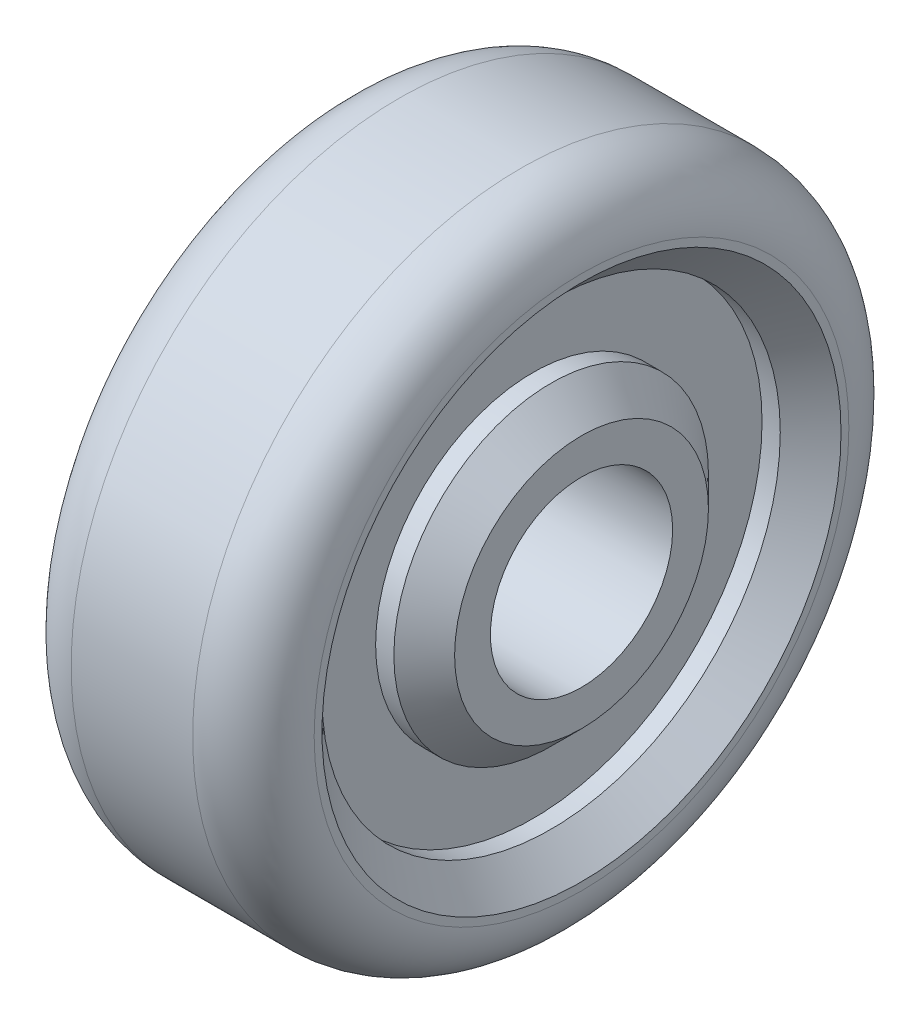
ISO-10303-21;
HEADER;
FILE_DESCRIPTION(('STEP AP214'),'2;1');
FILE_NAME('part.step','',(''),(''),'','','');
FILE_SCHEMA(('AUTOMOTIVE_DESIGN { 1 0 10303 214 1 1 1 1 }'));
ENDSEC;
DATA;
#1=APPLICATION_CONTEXT('core data for automotive mechanical design processes');
#2=APPLICATION_PROTOCOL_DEFINITION('international standard','automotive_design',2000,#1);
#3=PRODUCT_CONTEXT('',#1,'mechanical');
#4=PRODUCT('Part','Part','',(#3));
#5=PRODUCT_RELATED_PRODUCT_CATEGORY('part','',(#4));
#6=PRODUCT_DEFINITION_FORMATION('','',#4);
#7=PRODUCT_DEFINITION_CONTEXT('part definition',#1,'design');
#8=PRODUCT_DEFINITION('design','',#6,#7);
#9=PRODUCT_DEFINITION_SHAPE('','',#8);
#10=(LENGTH_UNIT() NAMED_UNIT(*) SI_UNIT(.MILLI.,.METRE.));
#11=(NAMED_UNIT(*) PLANE_ANGLE_UNIT() SI_UNIT($,.RADIAN.));
#12=(NAMED_UNIT(*) SI_UNIT($,.STERADIAN.) SOLID_ANGLE_UNIT());
#13=UNCERTAINTY_MEASURE_WITH_UNIT(LENGTH_MEASURE(1.E-05),#10,'distance_accuracy_value','');
#14=(GEOMETRIC_REPRESENTATION_CONTEXT(3) GLOBAL_UNCERTAINTY_ASSIGNED_CONTEXT((#13)) GLOBAL_UNIT_ASSIGNED_CONTEXT((#10,
#11,#12)) REPRESENTATION_CONTEXT('',''));
#15=CARTESIAN_POINT('',(0.,0.,0.));
#16=DIRECTION('',(0.,0.,1.));
#17=DIRECTION('',(1.,0.,0.));
#18=AXIS2_PLACEMENT_3D('',#15,#16,#17);
#19=CARTESIAN_POINT('',(-20.,0.,0.));
#20=DIRECTION('',(1.,0.,0.));
#21=DIRECTION('',(0.,0.,-1.));
#22=AXIS2_PLACEMENT_3D('',#19,#20,#21);
#23=PLANE('',#22);
#24=CARTESIAN_POINT('',(-20.,0.,0.));
#25=DIRECTION('',(1.,0.,0.));
#26=DIRECTION('',(0.,0.,-1.));
#27=AXIS2_PLACEMENT_3D('',#24,#25,#26);
#28=CIRCLE('',#27,15.);
#29=CARTESIAN_POINT('',(-20.,0.,-15.));
#30=VERTEX_POINT('',#29);
#31=EDGE_CURVE('E90',#30,#30,#28,.T.);
#32=ORIENTED_EDGE('',*,*,#31,.T.);
#33=EDGE_LOOP('',(#32));
#34=FACE_BOUND('',#33,.T.);
#35=CARTESIAN_POINT('',(-20.,0.,0.));
#36=DIRECTION('',(1.,0.,0.));
#37=DIRECTION('',(0.,0.,-1.));
#38=AXIS2_PLACEMENT_3D('',#35,#36,#37);
#39=CIRCLE('',#38,20.8892081585956);
#40=CARTESIAN_POINT('',(-20.,0.,-20.8892081585956));
#41=VERTEX_POINT('',#40);
#42=EDGE_CURVE('E10',#41,#41,#39,.T.);
#43=ORIENTED_EDGE('',*,*,#42,.F.);
#44=EDGE_LOOP('',(#43));
#45=FACE_BOUND('',#44,.T.);
#46=ADVANCED_FACE('F39',(#34,#45),#23,.F.);
#47=CARTESIAN_POINT('',(-20.,0.,0.));
#48=DIRECTION('',(1.,0.,0.));
#49=DIRECTION('',(0.,0.,1.));
#50=AXIS2_PLACEMENT_3D('',#47,#48,#49);
#51=CONICAL_SURFACE('',#50,20.8892081585956,0.785398163397446);
#52=CARTESIAN_POINT('',(-15.,0.,0.));
#53=DIRECTION('',(1.,0.,0.));
#54=DIRECTION('',(0.,0.,-1.));
#55=AXIS2_PLACEMENT_3D('',#52,#53,#54);
#56=CIRCLE('',#55,25.8892081585956);
#57=CARTESIAN_POINT('',(-15.,0.,-25.8892081585956));
#58=VERTEX_POINT('',#57);
#59=EDGE_CURVE('E62',#58,#58,#56,.F.);
#60=ORIENTED_EDGE('',*,*,#59,.T.);
#61=EDGE_LOOP('',(#60));
#62=FACE_BOUND('',#61,.T.);
#63=ORIENTED_EDGE('',*,*,#42,.T.);
#64=EDGE_LOOP('',(#63));
#65=FACE_BOUND('',#64,.T.);
#66=ADVANCED_FACE('F41',(#62,#65),#51,.T.);
#67=CARTESIAN_POINT('',(-15.,0.,0.));
#68=DIRECTION('',(-1.,0.,0.));
#69=DIRECTION('',(0.,0.,-1.));
#70=AXIS2_PLACEMENT_3D('',#67,#68,#69);
#71=CONICAL_SURFACE('',#70,37.7114890454387,0.78539816339745);
#72=CARTESIAN_POINT('',(-20.,0.,0.));
#73=DIRECTION('',(1.,0.,0.));
#74=DIRECTION('',(0.,0.,-1.));
#75=AXIS2_PLACEMENT_3D('',#72,#73,#74);
#76=CIRCLE('',#75,42.7114890454388);
#77=CARTESIAN_POINT('',(-20.,0.,-42.7114890454388));
#78=VERTEX_POINT('',#77);
#79=EDGE_CURVE('E46',#78,#78,#76,.F.);
#80=ORIENTED_EDGE('',*,*,#79,.T.);
#81=EDGE_LOOP('',(#80));
#82=FACE_BOUND('',#81,.T.);
#83=CARTESIAN_POINT('',(-15.,0.,0.));
#84=DIRECTION('',(1.,0.,0.));
#85=DIRECTION('',(0.,0.,-1.));
#86=AXIS2_PLACEMENT_3D('',#83,#84,#85);
#87=CIRCLE('',#86,37.7114890454387);
#88=CARTESIAN_POINT('',(-15.,0.,-37.7114890454387));
#89=VERTEX_POINT('',#88);
#90=EDGE_CURVE('E50',#89,#89,#87,.T.);
#91=ORIENTED_EDGE('',*,*,#90,.T.);
#92=EDGE_LOOP('',(#91));
#93=FACE_BOUND('',#92,.T.);
#94=ADVANCED_FACE('F129',(#82,#93),#71,.F.);
#95=CARTESIAN_POINT('',(-12.,0.,0.));
#96=DIRECTION('',(-1.,0.,0.));
#97=DIRECTION('',(0.,0.,-1.));
#98=AXIS2_PLACEMENT_3D('',#95,#96,#97);
#99=CYLINDRICAL_SURFACE('',#98,37.7114890454387);
#100=ORIENTED_EDGE('',*,*,#90,.F.);
#101=EDGE_LOOP('',(#100));
#102=FACE_BOUND('',#101,.T.);
#103=CARTESIAN_POINT('',(-12.,0.,0.));
#104=DIRECTION('',(1.,0.,0.));
#105=DIRECTION('',(0.,0.,-1.));
#106=AXIS2_PLACEMENT_3D('',#103,#104,#105);
#107=CIRCLE('',#106,37.7114890454387);
#108=CARTESIAN_POINT('',(-12.,0.,-37.7114890454387));
#109=VERTEX_POINT('',#108);
#110=EDGE_CURVE('E54',#109,#109,#107,.T.);
#111=ORIENTED_EDGE('',*,*,#110,.T.);
#112=EDGE_LOOP('',(#111));
#113=FACE_BOUND('',#112,.T.);
#114=ADVANCED_FACE('F184',(#102,#113),#99,.F.);
#115=CARTESIAN_POINT('',(-12.,0.,0.));
#116=DIRECTION('',(-1.,0.,0.));
#117=DIRECTION('',(0.,0.,-1.));
#118=AXIS2_PLACEMENT_3D('',#115,#116,#117);
#119=PLANE('',#118);
#120=CARTESIAN_POINT('',(-12.,0.,0.));
#121=DIRECTION('',(1.,0.,0.));
#122=DIRECTION('',(0.,0.,-1.));
#123=AXIS2_PLACEMENT_3D('',#120,#121,#122);
#124=CIRCLE('',#123,25.8892081585956);
#125=CARTESIAN_POINT('',(-12.,0.,-25.8892081585956));
#126=VERTEX_POINT('',#125);
#127=EDGE_CURVE('E59',#126,#126,#124,.T.);
#128=ORIENTED_EDGE('',*,*,#127,.T.);
#129=EDGE_LOOP('',(#128));
#130=FACE_BOUND('',#129,.T.);
#131=ORIENTED_EDGE('',*,*,#110,.F.);
#132=EDGE_LOOP('',(#131));
#133=FACE_BOUND('',#132,.T.);
#134=ADVANCED_FACE('F180',(#130,#133),#119,.T.);
#135=CARTESIAN_POINT('',(-12.,0.,0.));
#136=DIRECTION('',(-1.,0.,0.));
#137=DIRECTION('',(0.,0.,-1.));
#138=AXIS2_PLACEMENT_3D('',#135,#136,#137);
#139=CYLINDRICAL_SURFACE('',#138,25.8892081585956);
#140=ORIENTED_EDGE('',*,*,#59,.F.);
#141=EDGE_LOOP('',(#140));
#142=FACE_BOUND('',#141,.T.);
#143=ORIENTED_EDGE('',*,*,#127,.F.);
#144=EDGE_LOOP('',(#143));
#145=FACE_BOUND('',#144,.T.);
#146=ADVANCED_FACE('F177',(#142,#145),#139,.T.);
#147=CARTESIAN_POINT('',(20.,0.,0.));
#148=DIRECTION('',(1.,0.,0.));
#149=DIRECTION('',(0.,0.,-1.));
#150=AXIS2_PLACEMENT_3D('',#147,#148,#149);
#151=PLANE('',#150);
#152=CARTESIAN_POINT('',(20.,0.,0.));
#153=DIRECTION('',(1.,0.,0.));
#154=DIRECTION('',(0.,0.,-1.));
#155=AXIS2_PLACEMENT_3D('',#152,#153,#154);
#156=CIRCLE('',#155,20.8892081585956);
#157=CARTESIAN_POINT('',(20.,0.,-20.8892081585956));
#158=VERTEX_POINT('',#157);
#159=EDGE_CURVE('E74',#158,#158,#156,.T.);
#160=ORIENTED_EDGE('',*,*,#159,.T.);
#161=EDGE_LOOP('',(#160));
#162=FACE_BOUND('',#161,.T.);
#163=CARTESIAN_POINT('',(20.,0.,0.));
#164=DIRECTION('',(1.,0.,0.));
#165=DIRECTION('',(0.,0.,-1.));
#166=AXIS2_PLACEMENT_3D('',#163,#164,#165);
#167=CIRCLE('',#166,15.);
#168=CARTESIAN_POINT('',(20.,0.,-15.));
#169=VERTEX_POINT('',#168);
#170=EDGE_CURVE('E89',#169,#169,#167,.T.);
#171=ORIENTED_EDGE('',*,*,#170,.F.);
#172=EDGE_LOOP('',(#171));
#173=FACE_BOUND('',#172,.T.);
#174=ADVANCED_FACE('F144',(#162,#173),#151,.T.);
#175=CARTESIAN_POINT('',(20.,0.,0.));
#176=DIRECTION('',(1.,0.,0.));
#177=DIRECTION('',(0.,0.,-1.));
#178=AXIS2_PLACEMENT_3D('',#175,#176,#177);
#179=CIRCLE('',#178,42.7114890454388);
#180=CARTESIAN_POINT('',(20.,0.,-42.7114890454388));
#181=VERTEX_POINT('',#180);
#182=EDGE_CURVE('E65',#181,#181,#179,.F.);
#183=ORIENTED_EDGE('',*,*,#182,.T.);
#184=EDGE_LOOP('',(#183));
#185=FACE_BOUND('',#184,.T.);
#186=CARTESIAN_POINT('',(20.,0.,0.));
#187=DIRECTION('',(1.,0.,0.));
#188=DIRECTION('',(0.,0.,-1.));
#189=AXIS2_PLACEMENT_3D('',#186,#187,#188);
#190=CIRCLE('',#189,44.);
#191=CARTESIAN_POINT('',(20.,0.,-44.));
#192=VERTEX_POINT('',#191);
#193=EDGE_CURVE('E77',#192,#192,#190,.T.);
#194=ORIENTED_EDGE('',*,*,#193,.T.);
#195=EDGE_LOOP('',(#194));
#196=FACE_BOUND('',#195,.T.);
#197=ADVANCED_FACE('F136',(#185,#196),#151,.T.);
#198=ORIENTED_EDGE('',*,*,#79,.F.);
#199=EDGE_LOOP('',(#198));
#200=FACE_BOUND('',#199,.T.);
#201=CARTESIAN_POINT('',(-20.,0.,0.));
#202=DIRECTION('',(1.,0.,0.));
#203=DIRECTION('',(0.,0.,-1.));
#204=AXIS2_PLACEMENT_3D('',#201,#202,#203);
#205=CIRCLE('',#204,44.);
#206=CARTESIAN_POINT('',(-20.,0.,-44.));
#207=VERTEX_POINT('',#206);
#208=EDGE_CURVE('E80',#207,#207,#205,.F.);
#209=ORIENTED_EDGE('',*,*,#208,.T.);
#210=EDGE_LOOP('',(#209));
#211=FACE_BOUND('',#210,.T.);
#212=ADVANCED_FACE('F125',(#200,#211),#23,.F.);
#213=CARTESIAN_POINT('',(20.,0.,0.));
#214=DIRECTION('',(-1.,0.,0.));
#215=DIRECTION('',(0.,0.,1.));
#216=AXIS2_PLACEMENT_3D('',#213,#214,#215);
#217=CYLINDRICAL_SURFACE('',#216,54.);
#218=CARTESIAN_POINT('',(-10.,0.,0.));
#219=DIRECTION('',(1.,0.,0.));
#220=DIRECTION('',(0.,0.,-1.));
#221=AXIS2_PLACEMENT_3D('',#218,#219,#220);
#222=CIRCLE('',#221,54.);
#223=CARTESIAN_POINT('',(-10.,0.,-54.));
#224=VERTEX_POINT('',#223);
#225=EDGE_CURVE('E83',#224,#224,#222,.T.);
#226=ORIENTED_EDGE('',*,*,#225,.T.);
#227=EDGE_LOOP('',(#226));
#228=FACE_BOUND('',#227,.T.);
#229=CARTESIAN_POINT('',(10.,0.,0.));
#230=DIRECTION('',(1.,0.,0.));
#231=DIRECTION('',(0.,0.,-1.));
#232=AXIS2_PLACEMENT_3D('',#229,#230,#231);
#233=CIRCLE('',#232,54.);
#234=CARTESIAN_POINT('',(10.,0.,-54.));
#235=VERTEX_POINT('',#234);
#236=EDGE_CURVE('E86',#235,#235,#233,.F.);
#237=ORIENTED_EDGE('',*,*,#236,.T.);
#238=EDGE_LOOP('',(#237));
#239=FACE_BOUND('',#238,.T.);
#240=ADVANCED_FACE('F135',(#228,#239),#217,.T.);
#241=CARTESIAN_POINT('',(20.,0.,0.));
#242=DIRECTION('',(-1.,0.,0.));
#243=DIRECTION('',(0.,0.,1.));
#244=AXIS2_PLACEMENT_3D('',#241,#242,#243);
#245=CYLINDRICAL_SURFACE('',#244,15.);
#246=ORIENTED_EDGE('',*,*,#170,.T.);
#247=EDGE_LOOP('',(#246));
#248=FACE_BOUND('',#247,.T.);
#249=ORIENTED_EDGE('',*,*,#31,.F.);
#250=EDGE_LOOP('',(#249));
#251=FACE_BOUND('',#250,.T.);
#252=ADVANCED_FACE('F142',(#248,#251),#245,.F.);
#253=CARTESIAN_POINT('',(-10.,0.,0.));
#254=DIRECTION('',(1.,0.,0.));
#255=DIRECTION('',(0.,0.,-1.));
#256=AXIS2_PLACEMENT_3D('',#253,#254,#255);
#257=TOROIDAL_SURFACE('',#256,44.,10.);
#258=ORIENTED_EDGE('',*,*,#208,.F.);
#259=EDGE_LOOP('',(#258));
#260=FACE_BOUND('',#259,.T.);
#261=ORIENTED_EDGE('',*,*,#225,.F.);
#262=EDGE_LOOP('',(#261));
#263=FACE_BOUND('',#262,.T.);
#264=ADVANCED_FACE('F118',(#260,#263),#257,.T.);
#265=CARTESIAN_POINT('',(10.,0.,0.));
#266=DIRECTION('',(1.,0.,0.));
#267=DIRECTION('',(0.,0.,-1.));
#268=AXIS2_PLACEMENT_3D('',#265,#266,#267);
#269=TOROIDAL_SURFACE('',#268,44.,10.);
#270=ORIENTED_EDGE('',*,*,#236,.F.);
#271=EDGE_LOOP('',(#270));
#272=FACE_BOUND('',#271,.T.);
#273=ORIENTED_EDGE('',*,*,#193,.F.);
#274=EDGE_LOOP('',(#273));
#275=FACE_BOUND('',#274,.T.);
#276=ADVANCED_FACE('F112',(#272,#275),#269,.T.);
#277=CARTESIAN_POINT('',(12.,0.,0.));
#278=DIRECTION('',(1.,0.,0.));
#279=DIRECTION('',(0.,0.,-1.));
#280=AXIS2_PLACEMENT_3D('',#277,#278,#279);
#281=CYLINDRICAL_SURFACE('',#280,37.7114890454387);
#282=CARTESIAN_POINT('',(15.,0.,0.));
#283=DIRECTION('',(1.,0.,0.));
#284=DIRECTION('',(0.,0.,-1.));
#285=AXIS2_PLACEMENT_3D('',#282,#283,#284);
#286=CIRCLE('',#285,37.7114890454387);
#287=CARTESIAN_POINT('',(15.,0.,-37.7114890454387));
#288=VERTEX_POINT('',#287);
#289=EDGE_CURVE('E68',#288,#288,#286,.T.);
#290=ORIENTED_EDGE('',*,*,#289,.T.);
#291=EDGE_LOOP('',(#290));
#292=FACE_BOUND('',#291,.T.);
#293=CARTESIAN_POINT('',(12.,0.,0.));
#294=DIRECTION('',(1.,0.,0.));
#295=DIRECTION('',(0.,0.,-1.));
#296=AXIS2_PLACEMENT_3D('',#293,#294,#295);
#297=CIRCLE('',#296,37.7114890454387);
#298=CARTESIAN_POINT('',(12.,0.,-37.7114890454387));
#299=VERTEX_POINT('',#298);
#300=EDGE_CURVE('E93',#299,#299,#297,.T.);
#301=ORIENTED_EDGE('',*,*,#300,.F.);
#302=EDGE_LOOP('',(#301));
#303=FACE_BOUND('',#302,.T.);
#304=ADVANCED_FACE('F107',(#292,#303),#281,.F.);
#305=CARTESIAN_POINT('',(12.,0.,0.));
#306=DIRECTION('',(1.,0.,0.));
#307=DIRECTION('',(0.,0.,-1.));
#308=AXIS2_PLACEMENT_3D('',#305,#306,#307);
#309=PLANE('',#308);
#310=CARTESIAN_POINT('',(12.,0.,0.));
#311=DIRECTION('',(1.,0.,0.));
#312=DIRECTION('',(0.,0.,-1.));
#313=AXIS2_PLACEMENT_3D('',#310,#311,#312);
#314=CIRCLE('',#313,25.8892081585956);
#315=CARTESIAN_POINT('',(12.,0.,-25.8892081585956));
#316=VERTEX_POINT('',#315);
#317=EDGE_CURVE('E98',#316,#316,#314,.T.);
#318=ORIENTED_EDGE('',*,*,#317,.F.);
#319=EDGE_LOOP('',(#318));
#320=FACE_BOUND('',#319,.T.);
#321=ORIENTED_EDGE('',*,*,#300,.T.);
#322=EDGE_LOOP('',(#321));
#323=FACE_BOUND('',#322,.T.);
#324=ADVANCED_FACE('F104',(#320,#323),#309,.T.);
#325=CARTESIAN_POINT('',(12.,0.,0.));
#326=DIRECTION('',(1.,0.,0.));
#327=DIRECTION('',(0.,0.,-1.));
#328=AXIS2_PLACEMENT_3D('',#325,#326,#327);
#329=CYLINDRICAL_SURFACE('',#328,25.8892081585956);
#330=CARTESIAN_POINT('',(15.,0.,0.));
#331=DIRECTION('',(1.,0.,0.));
#332=DIRECTION('',(0.,0.,-1.));
#333=AXIS2_PLACEMENT_3D('',#330,#331,#332);
#334=CIRCLE('',#333,25.8892081585956);
#335=CARTESIAN_POINT('',(15.,0.,-25.8892081585956));
#336=VERTEX_POINT('',#335);
#337=EDGE_CURVE('E71',#336,#336,#334,.F.);
#338=ORIENTED_EDGE('',*,*,#337,.T.);
#339=EDGE_LOOP('',(#338));
#340=FACE_BOUND('',#339,.T.);
#341=ORIENTED_EDGE('',*,*,#317,.T.);
#342=EDGE_LOOP('',(#341));
#343=FACE_BOUND('',#342,.T.);
#344=ADVANCED_FACE('F102',(#340,#343),#329,.T.);
#345=CARTESIAN_POINT('',(20.,0.,0.));
#346=DIRECTION('',(-1.,0.,0.));
#347=DIRECTION('',(0.,0.,1.));
#348=AXIS2_PLACEMENT_3D('',#345,#346,#347);
#349=CONICAL_SURFACE('',#348,20.8892081585956,0.785398163397446);
#350=ORIENTED_EDGE('',*,*,#337,.F.);
#351=EDGE_LOOP('',(#350));
#352=FACE_BOUND('',#351,.T.);
#353=ORIENTED_EDGE('',*,*,#159,.F.);
#354=EDGE_LOOP('',(#353));
#355=FACE_BOUND('',#354,.T.);
#356=ADVANCED_FACE('F164',(#352,#355),#349,.T.);
#357=CARTESIAN_POINT('',(15.,0.,0.));
#358=DIRECTION('',(1.,0.,0.));
#359=DIRECTION('',(0.,0.,-1.));
#360=AXIS2_PLACEMENT_3D('',#357,#358,#359);
#361=CONICAL_SURFACE('',#360,37.7114890454387,0.78539816339745);
#362=ORIENTED_EDGE('',*,*,#182,.F.);
#363=EDGE_LOOP('',(#362));
#364=FACE_BOUND('',#363,.T.);
#365=ORIENTED_EDGE('',*,*,#289,.F.);
#366=EDGE_LOOP('',(#365));
#367=FACE_BOUND('',#366,.T.);
#368=ADVANCED_FACE('F170',(#364,#367),#361,.F.);
#369=CLOSED_SHELL('',(#46,#66,#94,#114,#134,#146,#174,#197,#212,#240,#252,#264,#276,#304,#324,
#344,#356,#368));
#370=MANIFOLD_SOLID_BREP('B2',#369);
#371=ADVANCED_BREP_SHAPE_REPRESENTATION('',(#18,#370),#14);
#372=SHAPE_DEFINITION_REPRESENTATION(#9,#371);
ENDSEC;
END-ISO-10303-21;
